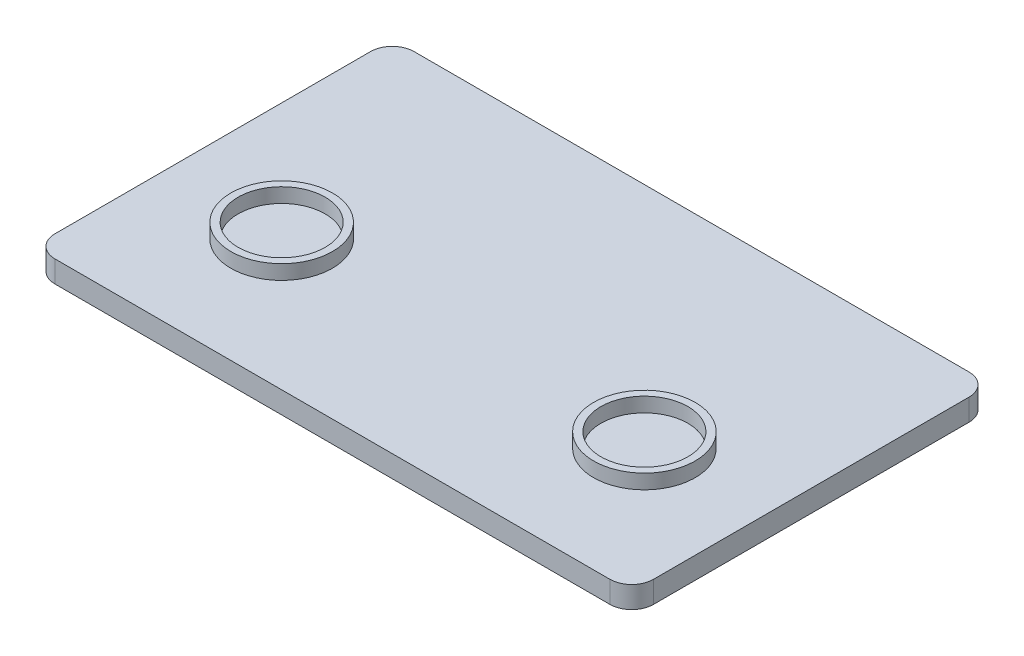
ISO-10303-21;
HEADER;
FILE_DESCRIPTION(('STEP AP214'),'2;1');
FILE_NAME('part.step','',(''),(''),'','','');
FILE_SCHEMA(('AUTOMOTIVE_DESIGN { 1 0 10303 214 1 1 1 1 }'));
ENDSEC;
DATA;
#1=APPLICATION_CONTEXT('core data for automotive mechanical design processes');
#2=APPLICATION_PROTOCOL_DEFINITION('international standard','automotive_design',2000,#1);
#3=PRODUCT_CONTEXT('',#1,'mechanical');
#4=PRODUCT('Part','Part','',(#3));
#5=PRODUCT_RELATED_PRODUCT_CATEGORY('part','',(#4));
#6=PRODUCT_DEFINITION_FORMATION('','',#4);
#7=PRODUCT_DEFINITION_CONTEXT('part definition',#1,'design');
#8=PRODUCT_DEFINITION('design','',#6,#7);
#9=PRODUCT_DEFINITION_SHAPE('','',#8);
#10=(LENGTH_UNIT() NAMED_UNIT(*) SI_UNIT(.MILLI.,.METRE.));
#11=(NAMED_UNIT(*) PLANE_ANGLE_UNIT() SI_UNIT($,.RADIAN.));
#12=(NAMED_UNIT(*) SI_UNIT($,.STERADIAN.) SOLID_ANGLE_UNIT());
#13=UNCERTAINTY_MEASURE_WITH_UNIT(LENGTH_MEASURE(1.E-05),#10,'distance_accuracy_value','');
#14=(GEOMETRIC_REPRESENTATION_CONTEXT(3) GLOBAL_UNCERTAINTY_ASSIGNED_CONTEXT((#13)) GLOBAL_UNIT_ASSIGNED_CONTEXT((#10,
#11,#12)) REPRESENTATION_CONTEXT('',''));
#15=CARTESIAN_POINT('',(0.,0.,0.));
#16=DIRECTION('',(0.,0.,1.));
#17=DIRECTION('',(1.,0.,0.));
#18=AXIS2_PLACEMENT_3D('',#15,#16,#17);
#19=CARTESIAN_POINT('',(38.25,3.,-21.75));
#20=DIRECTION('',(0.,-1.,0.));
#21=DIRECTION('',(0.,0.,-1.));
#22=AXIS2_PLACEMENT_3D('',#19,#20,#21);
#23=CYLINDRICAL_SURFACE('',#22,3.);
#24=CARTESIAN_POINT('',(38.25,0.,-21.75));
#25=DIRECTION('',(0.,1.,0.));
#26=DIRECTION('',(0.,0.,-1.));
#27=AXIS2_PLACEMENT_3D('',#24,#25,#26);
#28=CIRCLE('',#27,3.);
#29=CARTESIAN_POINT('',(41.25,0.,-21.75));
#30=VERTEX_POINT('',#29);
#31=CARTESIAN_POINT('',(38.25,0.,-24.75));
#32=VERTEX_POINT('',#31);
#33=EDGE_CURVE('E130',#30,#32,#28,.T.);
#34=ORIENTED_EDGE('',*,*,#33,.T.);
#35=DIRECTION('',(0.,-1.,0.));
#36=VECTOR('',#35,1.);
#37=CARTESIAN_POINT('',(38.25,3.,-24.75));
#38=LINE('',#37,#36);
#39=CARTESIAN_POINT('',(38.25,3.,-24.75));
#40=VERTEX_POINT('',#39);
#41=EDGE_CURVE('E158',#40,#32,#38,.T.);
#42=ORIENTED_EDGE('',*,*,#41,.F.);
#43=CARTESIAN_POINT('',(38.25,3.,-21.75));
#44=DIRECTION('',(0.,1.,0.));
#45=DIRECTION('',(0.,0.,-1.));
#46=AXIS2_PLACEMENT_3D('',#43,#44,#45);
#47=CIRCLE('',#46,3.);
#48=CARTESIAN_POINT('',(41.25,3.,-21.75));
#49=VERTEX_POINT('',#48);
#50=EDGE_CURVE('E145',#49,#40,#47,.T.);
#51=ORIENTED_EDGE('',*,*,#50,.F.);
#52=DIRECTION('',(0.,-1.,0.));
#53=VECTOR('',#52,1.);
#54=CARTESIAN_POINT('',(41.25,3.,-21.75));
#55=LINE('',#54,#53);
#56=EDGE_CURVE('E126',#49,#30,#55,.T.);
#57=ORIENTED_EDGE('',*,*,#56,.T.);
#58=EDGE_LOOP('',(#34,#42,#51,#57));
#59=FACE_BOUND('',#58,.T.);
#60=ADVANCED_FACE('F33',(#59),#23,.T.);
#61=CARTESIAN_POINT('',(-38.25,3.,-24.75));
#62=DIRECTION('',(0.,0.,1.));
#63=DIRECTION('',(1.,0.,0.));
#64=AXIS2_PLACEMENT_3D('',#61,#62,#63);
#65=PLANE('',#64);
#66=DIRECTION('',(-1.,0.,0.));
#67=VECTOR('',#66,1.);
#68=CARTESIAN_POINT('',(-38.25,0.,-24.75));
#69=LINE('',#68,#67);
#70=CARTESIAN_POINT('',(-38.25,0.,-24.75));
#71=VERTEX_POINT('',#70);
#72=EDGE_CURVE('E133',#32,#71,#69,.T.);
#73=ORIENTED_EDGE('',*,*,#72,.T.);
#74=DIRECTION('',(0.,-1.,0.));
#75=VECTOR('',#74,1.);
#76=CARTESIAN_POINT('',(-38.25,3.,-24.75));
#77=LINE('',#76,#75);
#78=CARTESIAN_POINT('',(-38.25,3.,-24.75));
#79=VERTEX_POINT('',#78);
#80=EDGE_CURVE('E155',#79,#71,#77,.T.);
#81=ORIENTED_EDGE('',*,*,#80,.F.);
#82=DIRECTION('',(-1.,0.,0.));
#83=VECTOR('',#82,1.);
#84=CARTESIAN_POINT('',(-38.25,3.,-24.75));
#85=LINE('',#84,#83);
#86=EDGE_CURVE('E93',#40,#79,#85,.T.);
#87=ORIENTED_EDGE('',*,*,#86,.F.);
#88=ORIENTED_EDGE('',*,*,#41,.T.);
#89=EDGE_LOOP('',(#73,#81,#87,#88));
#90=FACE_BOUND('',#89,.T.);
#91=ADVANCED_FACE('F191',(#90),#65,.F.);
#92=CARTESIAN_POINT('',(-38.25,3.,-21.75));
#93=DIRECTION('',(0.,-1.,0.));
#94=DIRECTION('',(0.,0.,-1.));
#95=AXIS2_PLACEMENT_3D('',#92,#93,#94);
#96=CYLINDRICAL_SURFACE('',#95,3.);
#97=CARTESIAN_POINT('',(-38.25,0.,-21.75));
#98=DIRECTION('',(0.,1.,0.));
#99=DIRECTION('',(0.,0.,1.));
#100=AXIS2_PLACEMENT_3D('',#97,#98,#99);
#101=CIRCLE('',#100,3.);
#102=CARTESIAN_POINT('',(-41.25,0.,-21.75));
#103=VERTEX_POINT('',#102);
#104=EDGE_CURVE('E136',#71,#103,#101,.T.);
#105=ORIENTED_EDGE('',*,*,#104,.T.);
#106=DIRECTION('',(0.,-1.,0.));
#107=VECTOR('',#106,1.);
#108=CARTESIAN_POINT('',(-41.25,3.,-21.75));
#109=LINE('',#108,#107);
#110=CARTESIAN_POINT('',(-41.25,3.,-21.75));
#111=VERTEX_POINT('',#110);
#112=EDGE_CURVE('E152',#111,#103,#109,.T.);
#113=ORIENTED_EDGE('',*,*,#112,.F.);
#114=CARTESIAN_POINT('',(-38.25,3.,-21.75));
#115=DIRECTION('',(0.,1.,0.));
#116=DIRECTION('',(0.,0.,1.));
#117=AXIS2_PLACEMENT_3D('',#114,#115,#116);
#118=CIRCLE('',#117,3.);
#119=EDGE_CURVE('E205',#79,#111,#118,.T.);
#120=ORIENTED_EDGE('',*,*,#119,.F.);
#121=ORIENTED_EDGE('',*,*,#80,.T.);
#122=EDGE_LOOP('',(#105,#113,#120,#121));
#123=FACE_BOUND('',#122,.T.);
#124=ADVANCED_FACE('F196',(#123),#96,.T.);
#125=CARTESIAN_POINT('',(-41.25,3.,-21.75));
#126=DIRECTION('',(1.,0.,0.));
#127=DIRECTION('',(0.,0.,-1.));
#128=AXIS2_PLACEMENT_3D('',#125,#126,#127);
#129=PLANE('',#128);
#130=DIRECTION('',(0.,0.,1.));
#131=VECTOR('',#130,1.);
#132=CARTESIAN_POINT('',(-41.25,0.,-21.75));
#133=LINE('',#132,#131);
#134=CARTESIAN_POINT('',(-41.25,0.,21.75));
#135=VERTEX_POINT('',#134);
#136=EDGE_CURVE('E138',#103,#135,#133,.T.);
#137=ORIENTED_EDGE('',*,*,#136,.T.);
#138=DIRECTION('',(0.,-1.,0.));
#139=VECTOR('',#138,1.);
#140=CARTESIAN_POINT('',(-41.25,3.,21.75));
#141=LINE('',#140,#139);
#142=CARTESIAN_POINT('',(-41.25,3.,21.75));
#143=VERTEX_POINT('',#142);
#144=EDGE_CURVE('E149',#143,#135,#141,.T.);
#145=ORIENTED_EDGE('',*,*,#144,.F.);
#146=DIRECTION('',(0.,0.,1.));
#147=VECTOR('',#146,1.);
#148=CARTESIAN_POINT('',(-41.25,3.,-21.75));
#149=LINE('',#148,#147);
#150=EDGE_CURVE('E207',#111,#143,#149,.T.);
#151=ORIENTED_EDGE('',*,*,#150,.F.);
#152=ORIENTED_EDGE('',*,*,#112,.T.);
#153=EDGE_LOOP('',(#137,#145,#151,#152));
#154=FACE_BOUND('',#153,.T.);
#155=ADVANCED_FACE('F330',(#154),#129,.F.);
#156=CARTESIAN_POINT('',(-38.25,3.,21.75));
#157=DIRECTION('',(0.,-1.,0.));
#158=DIRECTION('',(0.,0.,-1.));
#159=AXIS2_PLACEMENT_3D('',#156,#157,#158);
#160=CYLINDRICAL_SURFACE('',#159,3.);
#161=CARTESIAN_POINT('',(-38.25,0.,21.75));
#162=DIRECTION('',(0.,1.,0.));
#163=DIRECTION('',(0.,0.,1.));
#164=AXIS2_PLACEMENT_3D('',#161,#162,#163);
#165=CIRCLE('',#164,3.);
#166=CARTESIAN_POINT('',(-38.25,0.,24.75));
#167=VERTEX_POINT('',#166);
#168=EDGE_CURVE('E140',#135,#167,#165,.T.);
#169=ORIENTED_EDGE('',*,*,#168,.T.);
#170=DIRECTION('',(0.,-1.,0.));
#171=VECTOR('',#170,1.);
#172=CARTESIAN_POINT('',(-38.25,3.,24.75));
#173=LINE('',#172,#171);
#174=CARTESIAN_POINT('',(-38.25,3.,24.75));
#175=VERTEX_POINT('',#174);
#176=EDGE_CURVE('E121',#175,#167,#173,.T.);
#177=ORIENTED_EDGE('',*,*,#176,.F.);
#178=CARTESIAN_POINT('',(-38.25,3.,21.75));
#179=DIRECTION('',(0.,1.,0.));
#180=DIRECTION('',(0.,0.,1.));
#181=AXIS2_PLACEMENT_3D('',#178,#179,#180);
#182=CIRCLE('',#181,3.);
#183=EDGE_CURVE('E112',#143,#175,#182,.T.);
#184=ORIENTED_EDGE('',*,*,#183,.F.);
#185=ORIENTED_EDGE('',*,*,#144,.T.);
#186=EDGE_LOOP('',(#169,#177,#184,#185));
#187=FACE_BOUND('',#186,.T.);
#188=ADVANCED_FACE('F323',(#187),#160,.T.);
#189=CARTESIAN_POINT('',(-38.25,3.,24.75));
#190=DIRECTION('',(0.,0.,-1.));
#191=DIRECTION('',(-1.,0.,0.));
#192=AXIS2_PLACEMENT_3D('',#189,#190,#191);
#193=PLANE('',#192);
#194=DIRECTION('',(1.,0.,0.));
#195=VECTOR('',#194,1.);
#196=CARTESIAN_POINT('',(-38.25,0.,24.75));
#197=LINE('',#196,#195);
#198=CARTESIAN_POINT('',(38.25,0.,24.75));
#199=VERTEX_POINT('',#198);
#200=EDGE_CURVE('E120',#167,#199,#197,.T.);
#201=ORIENTED_EDGE('',*,*,#200,.T.);
#202=DIRECTION('',(0.,-1.,0.));
#203=VECTOR('',#202,1.);
#204=CARTESIAN_POINT('',(38.25,3.,24.75));
#205=LINE('',#204,#203);
#206=CARTESIAN_POINT('',(38.25,3.,24.75));
#207=VERTEX_POINT('',#206);
#208=EDGE_CURVE('E117',#207,#199,#205,.T.);
#209=ORIENTED_EDGE('',*,*,#208,.F.);
#210=DIRECTION('',(1.,0.,0.));
#211=VECTOR('',#210,1.);
#212=CARTESIAN_POINT('',(-38.25,3.,24.75));
#213=LINE('',#212,#211);
#214=EDGE_CURVE('E106',#175,#207,#213,.T.);
#215=ORIENTED_EDGE('',*,*,#214,.F.);
#216=ORIENTED_EDGE('',*,*,#176,.T.);
#217=EDGE_LOOP('',(#201,#209,#215,#216));
#218=FACE_BOUND('',#217,.T.);
#219=ADVANCED_FACE('F118',(#218),#193,.F.);
#220=CARTESIAN_POINT('',(38.25,3.,21.75));
#221=DIRECTION('',(0.,-1.,0.));
#222=DIRECTION('',(0.,0.,-1.));
#223=AXIS2_PLACEMENT_3D('',#220,#221,#222);
#224=CYLINDRICAL_SURFACE('',#223,3.);
#225=CARTESIAN_POINT('',(38.25,0.,21.75));
#226=DIRECTION('',(0.,1.,0.));
#227=DIRECTION('',(0.,0.,1.));
#228=AXIS2_PLACEMENT_3D('',#225,#226,#227);
#229=CIRCLE('',#228,3.);
#230=CARTESIAN_POINT('',(41.25,0.,21.75));
#231=VERTEX_POINT('',#230);
#232=EDGE_CURVE('E78',#199,#231,#229,.T.);
#233=ORIENTED_EDGE('',*,*,#232,.T.);
#234=DIRECTION('',(0.,-1.,0.));
#235=VECTOR('',#234,1.);
#236=CARTESIAN_POINT('',(41.25,3.,21.75));
#237=LINE('',#236,#235);
#238=CARTESIAN_POINT('',(41.25,3.,21.75));
#239=VERTEX_POINT('',#238);
#240=EDGE_CURVE('E122',#239,#231,#237,.T.);
#241=ORIENTED_EDGE('',*,*,#240,.F.);
#242=CARTESIAN_POINT('',(38.25,3.,21.75));
#243=DIRECTION('',(0.,1.,0.));
#244=DIRECTION('',(0.,0.,1.));
#245=AXIS2_PLACEMENT_3D('',#242,#243,#244);
#246=CIRCLE('',#245,3.);
#247=EDGE_CURVE('E110',#207,#239,#246,.T.);
#248=ORIENTED_EDGE('',*,*,#247,.F.);
#249=ORIENTED_EDGE('',*,*,#208,.T.);
#250=EDGE_LOOP('',(#233,#241,#248,#249));
#251=FACE_BOUND('',#250,.T.);
#252=ADVANCED_FACE('F124',(#251),#224,.T.);
#253=CARTESIAN_POINT('',(41.25,3.,-21.75));
#254=DIRECTION('',(-1.,0.,0.));
#255=DIRECTION('',(0.,0.,1.));
#256=AXIS2_PLACEMENT_3D('',#253,#254,#255);
#257=PLANE('',#256);
#258=DIRECTION('',(0.,0.,-1.));
#259=VECTOR('',#258,1.);
#260=CARTESIAN_POINT('',(41.25,0.,-21.75));
#261=LINE('',#260,#259);
#262=EDGE_CURVE('E84',#231,#30,#261,.T.);
#263=ORIENTED_EDGE('',*,*,#262,.T.);
#264=ORIENTED_EDGE('',*,*,#56,.F.);
#265=DIRECTION('',(0.,0.,-1.));
#266=VECTOR('',#265,1.);
#267=CARTESIAN_POINT('',(41.25,3.,-21.75));
#268=LINE('',#267,#266);
#269=EDGE_CURVE('E49',#239,#49,#268,.T.);
#270=ORIENTED_EDGE('',*,*,#269,.F.);
#271=ORIENTED_EDGE('',*,*,#240,.T.);
#272=EDGE_LOOP('',(#263,#264,#270,#271));
#273=FACE_BOUND('',#272,.T.);
#274=ADVANCED_FACE('F166',(#273),#257,.F.);
#275=CARTESIAN_POINT('',(38.25,3.,-21.75));
#276=DIRECTION('',(0.,-1.,0.));
#277=DIRECTION('',(0.,0.,-1.));
#278=AXIS2_PLACEMENT_3D('',#275,#276,#277);
#279=PLANE('',#278);
#280=CARTESIAN_POINT('',(25.,3.,6.75));
#281=DIRECTION('',(0.,-1.,0.));
#282=DIRECTION('',(0.,0.,-1.));
#283=AXIS2_PLACEMENT_3D('',#280,#281,#282);
#284=CIRCLE('',#283,7.);
#285=CARTESIAN_POINT('',(25.,3.,-0.250000000000005));
#286=VERTEX_POINT('',#285);
#287=EDGE_CURVE('E11',#286,#286,#284,.F.);
#288=ORIENTED_EDGE('',*,*,#287,.F.);
#289=EDGE_LOOP('',(#288));
#290=FACE_BOUND('',#289,.T.);
#291=CARTESIAN_POINT('',(-25.,3.,6.75));
#292=DIRECTION('',(0.,-1.,0.));
#293=DIRECTION('',(0.,0.,-1.));
#294=AXIS2_PLACEMENT_3D('',#291,#292,#293);
#295=CIRCLE('',#294,7.);
#296=CARTESIAN_POINT('',(-25.,3.,-0.250000000000005));
#297=VERTEX_POINT('',#296);
#298=EDGE_CURVE('E41',#297,#297,#295,.F.);
#299=ORIENTED_EDGE('',*,*,#298,.F.);
#300=EDGE_LOOP('',(#299));
#301=FACE_BOUND('',#300,.T.);
#302=ORIENTED_EDGE('',*,*,#50,.T.);
#303=ORIENTED_EDGE('',*,*,#86,.T.);
#304=ORIENTED_EDGE('',*,*,#119,.T.);
#305=ORIENTED_EDGE('',*,*,#150,.T.);
#306=ORIENTED_EDGE('',*,*,#183,.T.);
#307=ORIENTED_EDGE('',*,*,#214,.T.);
#308=ORIENTED_EDGE('',*,*,#247,.T.);
#309=ORIENTED_EDGE('',*,*,#269,.T.);
#310=EDGE_LOOP('',(#302,#303,#304,#305,#306,#307,#308,#309));
#311=FACE_BOUND('',#310,.T.);
#312=ADVANCED_FACE('F108',(#290,#301,#311),#279,.F.);
#313=CARTESIAN_POINT('',(38.25,0.,-21.75));
#314=DIRECTION('',(0.,-1.,0.));
#315=DIRECTION('',(0.,0.,-1.));
#316=AXIS2_PLACEMENT_3D('',#313,#314,#315);
#317=PLANE('',#316);
#318=ORIENTED_EDGE('',*,*,#33,.F.);
#319=ORIENTED_EDGE('',*,*,#262,.F.);
#320=ORIENTED_EDGE('',*,*,#232,.F.);
#321=ORIENTED_EDGE('',*,*,#200,.F.);
#322=ORIENTED_EDGE('',*,*,#168,.F.);
#323=ORIENTED_EDGE('',*,*,#136,.F.);
#324=ORIENTED_EDGE('',*,*,#104,.F.);
#325=ORIENTED_EDGE('',*,*,#72,.F.);
#326=EDGE_LOOP('',(#318,#319,#320,#321,#322,#323,#324,#325));
#327=FACE_BOUND('',#326,.T.);
#328=ADVANCED_FACE('F165',(#327),#317,.T.);
#329=CARTESIAN_POINT('',(-25.,5.,6.75));
#330=DIRECTION('',(0.,1.,0.));
#331=DIRECTION('',(0.,0.,1.));
#332=AXIS2_PLACEMENT_3D('',#329,#330,#331);
#333=PLANE('',#332);
#334=CARTESIAN_POINT('',(-25.,5.,6.75));
#335=DIRECTION('',(0.,1.,0.));
#336=DIRECTION('',(0.,0.,1.));
#337=AXIS2_PLACEMENT_3D('',#334,#335,#336);
#338=CIRCLE('',#337,7.);
#339=CARTESIAN_POINT('',(-25.,5.,13.75));
#340=VERTEX_POINT('',#339);
#341=EDGE_CURVE('E134',#340,#340,#338,.T.);
#342=ORIENTED_EDGE('',*,*,#341,.T.);
#343=EDGE_LOOP('',(#342));
#344=FACE_BOUND('',#343,.T.);
#345=CARTESIAN_POINT('',(-25.,5.,6.75));
#346=DIRECTION('',(0.,1.,0.));
#347=DIRECTION('',(0.,0.,1.));
#348=AXIS2_PLACEMENT_3D('',#345,#346,#347);
#349=CIRCLE('',#348,6.);
#350=CARTESIAN_POINT('',(-25.,5.,12.75));
#351=VERTEX_POINT('',#350);
#352=EDGE_CURVE('E215',#351,#351,#349,.T.);
#353=ORIENTED_EDGE('',*,*,#352,.F.);
#354=EDGE_LOOP('',(#353));
#355=FACE_BOUND('',#354,.T.);
#356=ADVANCED_FACE('F176',(#344,#355),#333,.T.);
#357=CARTESIAN_POINT('',(-25.,5.,6.75));
#358=DIRECTION('',(0.,-1.,0.));
#359=DIRECTION('',(0.,0.,-1.));
#360=AXIS2_PLACEMENT_3D('',#357,#358,#359);
#361=CYLINDRICAL_SURFACE('',#360,7.);
#362=ORIENTED_EDGE('',*,*,#341,.F.);
#363=EDGE_LOOP('',(#362));
#364=FACE_BOUND('',#363,.T.);
#365=ORIENTED_EDGE('',*,*,#298,.T.);
#366=EDGE_LOOP('',(#365));
#367=FACE_BOUND('',#366,.T.);
#368=ADVANCED_FACE('F162',(#364,#367),#361,.T.);
#369=CARTESIAN_POINT('',(-25.,5.,6.75));
#370=DIRECTION('',(0.,-1.,0.));
#371=DIRECTION('',(0.,0.,-1.));
#372=AXIS2_PLACEMENT_3D('',#369,#370,#371);
#373=CYLINDRICAL_SURFACE('',#372,6.);
#374=ORIENTED_EDGE('',*,*,#352,.T.);
#375=EDGE_LOOP('',(#374));
#376=FACE_BOUND('',#375,.T.);
#377=CARTESIAN_POINT('',(-25.,3.,6.75));
#378=DIRECTION('',(0.,1.,0.));
#379=DIRECTION('',(0.,0.,1.));
#380=AXIS2_PLACEMENT_3D('',#377,#378,#379);
#381=CIRCLE('',#380,6.);
#382=CARTESIAN_POINT('',(-25.,3.,12.75));
#383=VERTEX_POINT('',#382);
#384=EDGE_CURVE('E216',#383,#383,#381,.T.);
#385=ORIENTED_EDGE('',*,*,#384,.F.);
#386=EDGE_LOOP('',(#385));
#387=FACE_BOUND('',#386,.T.);
#388=ADVANCED_FACE('F188',(#376,#387),#373,.F.);
#389=ORIENTED_EDGE('',*,*,#384,.T.);
#390=EDGE_LOOP('',(#389));
#391=FACE_BOUND('',#390,.T.);
#392=ADVANCED_FACE('F170',(#391),#279,.F.);
#393=CARTESIAN_POINT('',(25.,5.,6.75));
#394=DIRECTION('',(0.,-1.,0.));
#395=DIRECTION('',(0.,0.,-1.));
#396=AXIS2_PLACEMENT_3D('',#393,#394,#395);
#397=PLANE('',#396);
#398=CARTESIAN_POINT('',(25.,5.,6.75));
#399=DIRECTION('',(0.,1.,0.));
#400=DIRECTION('',(0.,0.,-1.));
#401=AXIS2_PLACEMENT_3D('',#398,#399,#400);
#402=CIRCLE('',#401,7.);
#403=CARTESIAN_POINT('',(25.,5.,-0.250000000000005));
#404=VERTEX_POINT('',#403);
#405=EDGE_CURVE('E219',#404,#404,#402,.T.);
#406=ORIENTED_EDGE('',*,*,#405,.T.);
#407=EDGE_LOOP('',(#406));
#408=FACE_BOUND('',#407,.T.);
#409=CARTESIAN_POINT('',(25.,5.,6.75));
#410=DIRECTION('',(0.,1.,0.));
#411=DIRECTION('',(0.,0.,-1.));
#412=AXIS2_PLACEMENT_3D('',#409,#410,#411);
#413=CIRCLE('',#412,6.);
#414=CARTESIAN_POINT('',(25.,5.,0.749999999999997));
#415=VERTEX_POINT('',#414);
#416=EDGE_CURVE('E224',#415,#415,#413,.T.);
#417=ORIENTED_EDGE('',*,*,#416,.F.);
#418=EDGE_LOOP('',(#417));
#419=FACE_BOUND('',#418,.T.);
#420=ADVANCED_FACE('F187',(#408,#419),#397,.F.);
#421=CARTESIAN_POINT('',(25.,5.,6.75));
#422=DIRECTION('',(0.,-1.,0.));
#423=DIRECTION('',(0.,0.,-1.));
#424=AXIS2_PLACEMENT_3D('',#421,#422,#423);
#425=CYLINDRICAL_SURFACE('',#424,7.);
#426=ORIENTED_EDGE('',*,*,#405,.F.);
#427=EDGE_LOOP('',(#426));
#428=FACE_BOUND('',#427,.T.);
#429=ORIENTED_EDGE('',*,*,#287,.T.);
#430=EDGE_LOOP('',(#429));
#431=FACE_BOUND('',#430,.T.);
#432=ADVANCED_FACE('F234',(#428,#431),#425,.T.);
#433=CARTESIAN_POINT('',(25.,5.,6.75));
#434=DIRECTION('',(0.,-1.,0.));
#435=DIRECTION('',(0.,0.,-1.));
#436=AXIS2_PLACEMENT_3D('',#433,#434,#435);
#437=CYLINDRICAL_SURFACE('',#436,6.);
#438=ORIENTED_EDGE('',*,*,#416,.T.);
#439=EDGE_LOOP('',(#438));
#440=FACE_BOUND('',#439,.T.);
#441=CARTESIAN_POINT('',(25.,3.,6.75));
#442=DIRECTION('',(0.,1.,0.));
#443=DIRECTION('',(0.,0.,-1.));
#444=AXIS2_PLACEMENT_3D('',#441,#442,#443);
#445=CIRCLE('',#444,6.);
#446=CARTESIAN_POINT('',(25.,3.,0.749999999999997));
#447=VERTEX_POINT('',#446);
#448=EDGE_CURVE('E225',#447,#447,#445,.T.);
#449=ORIENTED_EDGE('',*,*,#448,.F.);
#450=EDGE_LOOP('',(#449));
#451=FACE_BOUND('',#450,.T.);
#452=ADVANCED_FACE('F184',(#440,#451),#437,.F.);
#453=ORIENTED_EDGE('',*,*,#448,.T.);
#454=EDGE_LOOP('',(#453));
#455=FACE_BOUND('',#454,.T.);
#456=ADVANCED_FACE('F169',(#455),#279,.F.);
#457=CLOSED_SHELL('',(#60,#91,#124,#155,#188,#219,#252,#274,#312,#328,#356,#368,#388,#392,#420,
#432,#452,#456));
#458=MANIFOLD_SOLID_BREP('B2',#457);
#459=ADVANCED_BREP_SHAPE_REPRESENTATION('',(#18,#458),#14);
#460=SHAPE_DEFINITION_REPRESENTATION(#9,#459);
ENDSEC;
END-ISO-10303-21;
